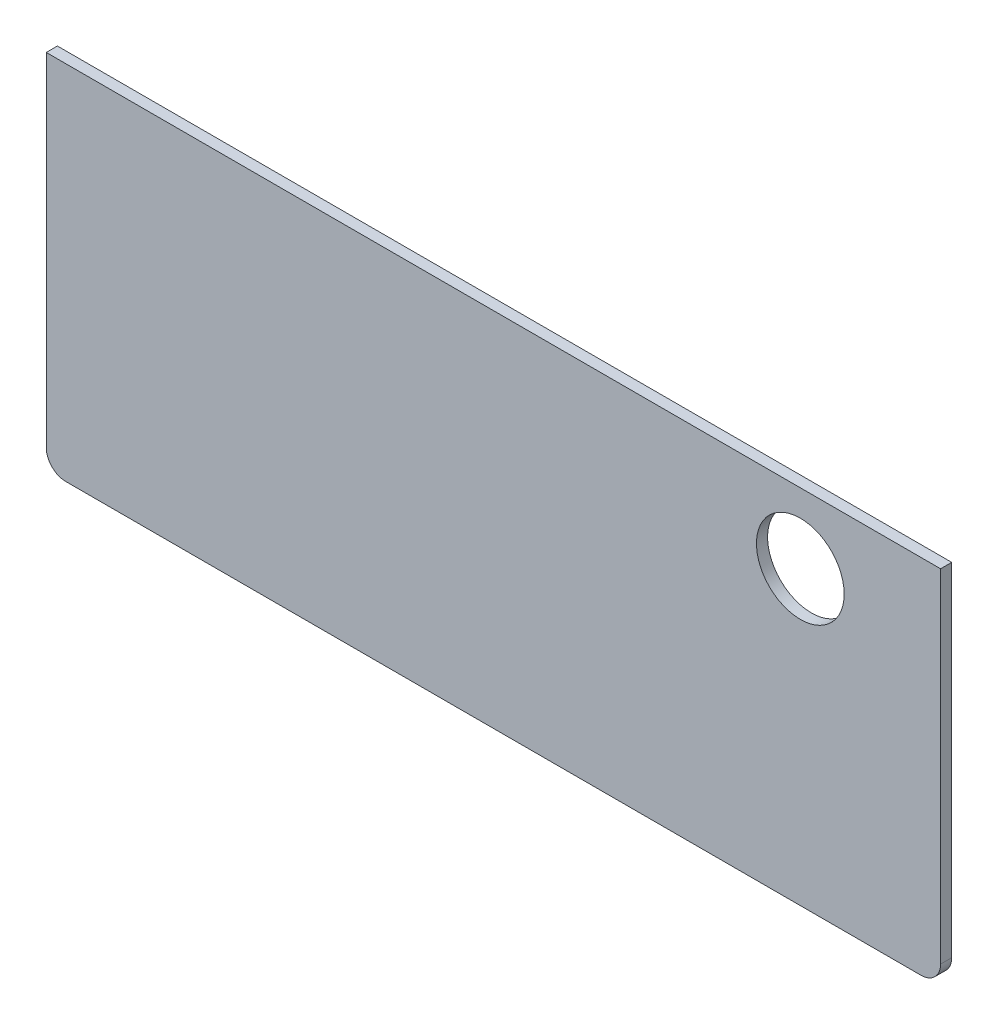
ISO-10303-21;
HEADER;
FILE_DESCRIPTION(('STEP AP214'),'2;1');
FILE_NAME('part.step','',(''),(''),'','','');
FILE_SCHEMA(('AUTOMOTIVE_DESIGN { 1 0 10303 214 1 1 1 1 }'));
ENDSEC;
DATA;
#1=APPLICATION_CONTEXT('core data for automotive mechanical design processes');
#2=APPLICATION_PROTOCOL_DEFINITION('international standard','automotive_design',2000,#1);
#3=PRODUCT_CONTEXT('',#1,'mechanical');
#4=PRODUCT('Part','Part','',(#3));
#5=PRODUCT_RELATED_PRODUCT_CATEGORY('part','',(#4));
#6=PRODUCT_DEFINITION_FORMATION('','',#4);
#7=PRODUCT_DEFINITION_CONTEXT('part definition',#1,'design');
#8=PRODUCT_DEFINITION('design','',#6,#7);
#9=PRODUCT_DEFINITION_SHAPE('','',#8);
#10=(LENGTH_UNIT() NAMED_UNIT(*) SI_UNIT(.MILLI.,.METRE.));
#11=(NAMED_UNIT(*) PLANE_ANGLE_UNIT() SI_UNIT($,.RADIAN.));
#12=(NAMED_UNIT(*) SI_UNIT($,.STERADIAN.) SOLID_ANGLE_UNIT());
#13=UNCERTAINTY_MEASURE_WITH_UNIT(LENGTH_MEASURE(1.E-05),#10,'distance_accuracy_value','');
#14=(GEOMETRIC_REPRESENTATION_CONTEXT(3) GLOBAL_UNCERTAINTY_ASSIGNED_CONTEXT((#13)) GLOBAL_UNIT_ASSIGNED_CONTEXT((#10,
#11,#12)) REPRESENTATION_CONTEXT('',''));
#15=CARTESIAN_POINT('',(0.,0.,0.));
#16=DIRECTION('',(0.,0.,1.));
#17=DIRECTION('',(1.,0.,0.));
#18=AXIS2_PLACEMENT_3D('',#15,#16,#17);
#19=CARTESIAN_POINT('',(0.,0.,3.175));
#20=DIRECTION('',(0.,0.,1.));
#21=DIRECTION('',(1.,0.,0.));
#22=AXIS2_PLACEMENT_3D('',#19,#20,#21);
#23=PLANE('',#22);
#24=DIRECTION('',(0.,-1.,0.));
#25=VECTOR('',#24,1.);
#26=CARTESIAN_POINT('',(-151.765375854214,27.1867881548974,3.175));
#27=LINE('',#26,#25);
#28=CARTESIAN_POINT('',(-151.765375854214,27.1867881548974,3.175));
#29=VERTEX_POINT('',#28);
#30=CARTESIAN_POINT('',(-151.765375854214,-70.4319618451025,3.175));
#31=VERTEX_POINT('',#30);
#32=EDGE_CURVE('E86',#29,#31,#27,.T.);
#33=ORIENTED_EDGE('',*,*,#32,.T.);
#34=CARTESIAN_POINT('',(-146.209125854214,-70.4319618451025,3.175));
#35=DIRECTION('',(0.,0.,1.));
#36=DIRECTION('',(1.,0.,0.));
#37=AXIS2_PLACEMENT_3D('',#34,#35,#36);
#38=CIRCLE('',#37,5.55625);
#39=CARTESIAN_POINT('',(-146.209125854214,-75.9882118451025,3.175));
#40=VERTEX_POINT('',#39);
#41=EDGE_CURVE('E41',#31,#40,#38,.T.);
#42=ORIENTED_EDGE('',*,*,#41,.T.);
#43=DIRECTION('',(1.,0.,0.));
#44=VECTOR('',#43,1.);
#45=CARTESIAN_POINT('',(-151.765375854214,-75.9882118451025,3.175));
#46=LINE('',#45,#44);
#47=CARTESIAN_POINT('',(97.6783741457859,-75.9882118451025,3.175));
#48=VERTEX_POINT('',#47);
#49=EDGE_CURVE('E93',#40,#48,#46,.T.);
#50=ORIENTED_EDGE('',*,*,#49,.T.);
#51=CARTESIAN_POINT('',(97.6783741457859,-70.4319618451025,3.175));
#52=DIRECTION('',(0.,0.,1.));
#53=DIRECTION('',(1.,0.,0.));
#54=AXIS2_PLACEMENT_3D('',#51,#52,#53);
#55=CIRCLE('',#54,5.55625);
#56=CARTESIAN_POINT('',(103.234624145786,-70.4319618451025,3.175));
#57=VERTEX_POINT('',#56);
#58=EDGE_CURVE('E48',#48,#57,#55,.T.);
#59=ORIENTED_EDGE('',*,*,#58,.T.);
#60=DIRECTION('',(0.,1.,0.));
#61=VECTOR('',#60,1.);
#62=CARTESIAN_POINT('',(103.234624145786,-75.9882118451025,3.175));
#63=LINE('',#62,#61);
#64=CARTESIAN_POINT('',(103.234624145786,27.1867881548975,3.175));
#65=VERTEX_POINT('',#64);
#66=EDGE_CURVE('E98',#57,#65,#63,.T.);
#67=ORIENTED_EDGE('',*,*,#66,.T.);
#68=DIRECTION('',(-1.,0.,0.));
#69=VECTOR('',#68,1.);
#70=CARTESIAN_POINT('',(103.234624145786,27.1867881548975,3.175));
#71=LINE('',#70,#69);
#72=EDGE_CURVE('E94',#65,#29,#71,.T.);
#73=ORIENTED_EDGE('',*,*,#72,.T.);
#74=EDGE_LOOP('',(#33,#42,#50,#59,#67,#73));
#75=FACE_BOUND('',#74,.T.);
#76=CARTESIAN_POINT('',(63.2346241457858,7.18678815489747,3.175));
#77=DIRECTION('',(0.,0.,1.));
#78=DIRECTION('',(1.,0.,0.));
#79=AXIS2_PLACEMENT_3D('',#76,#77,#78);
#80=CIRCLE('',#79,12.5);
#81=CARTESIAN_POINT('',(75.7346241457858,7.18678815489747,3.175));
#82=VERTEX_POINT('',#81);
#83=EDGE_CURVE('E139',#82,#82,#80,.T.);
#84=ORIENTED_EDGE('',*,*,#83,.F.);
#85=EDGE_LOOP('',(#84));
#86=FACE_BOUND('',#85,.T.);
#87=ADVANCED_FACE('F33',(#75,#86),#23,.T.);
#88=CARTESIAN_POINT('',(0.,0.,0.));
#89=DIRECTION('',(0.,0.,1.));
#90=DIRECTION('',(1.,0.,0.));
#91=AXIS2_PLACEMENT_3D('',#88,#89,#90);
#92=PLANE('',#91);
#93=DIRECTION('',(1.,0.,0.));
#94=VECTOR('',#93,1.);
#95=CARTESIAN_POINT('',(-151.765375854214,-75.9882118451025,0.));
#96=LINE('',#95,#94);
#97=CARTESIAN_POINT('',(-146.209125854214,-75.9882118451025,0.));
#98=VERTEX_POINT('',#97);
#99=CARTESIAN_POINT('',(97.6783741457859,-75.9882118451025,0.));
#100=VERTEX_POINT('',#99);
#101=EDGE_CURVE('E136',#98,#100,#96,.T.);
#102=ORIENTED_EDGE('',*,*,#101,.F.);
#103=CARTESIAN_POINT('',(-146.209125854214,-70.4319618451025,0.));
#104=DIRECTION('',(0.,0.,1.));
#105=DIRECTION('',(1.,0.,0.));
#106=AXIS2_PLACEMENT_3D('',#103,#104,#105);
#107=CIRCLE('',#106,5.55625);
#108=CARTESIAN_POINT('',(-151.765375854214,-70.4319618451025,0.));
#109=VERTEX_POINT('',#108);
#110=EDGE_CURVE('E119',#98,#109,#107,.F.);
#111=ORIENTED_EDGE('',*,*,#110,.T.);
#112=DIRECTION('',(0.,-1.,0.));
#113=VECTOR('',#112,1.);
#114=CARTESIAN_POINT('',(-151.765375854214,27.1867881548974,0.));
#115=LINE('',#114,#113);
#116=CARTESIAN_POINT('',(-151.765375854214,27.1867881548974,0.));
#117=VERTEX_POINT('',#116);
#118=EDGE_CURVE('E135',#117,#109,#115,.T.);
#119=ORIENTED_EDGE('',*,*,#118,.F.);
#120=DIRECTION('',(-1.,0.,0.));
#121=VECTOR('',#120,1.);
#122=CARTESIAN_POINT('',(103.234624145786,27.1867881548975,0.));
#123=LINE('',#122,#121);
#124=CARTESIAN_POINT('',(103.234624145786,27.1867881548975,0.));
#125=VERTEX_POINT('',#124);
#126=EDGE_CURVE('E106',#125,#117,#123,.T.);
#127=ORIENTED_EDGE('',*,*,#126,.F.);
#128=DIRECTION('',(0.,1.,0.));
#129=VECTOR('',#128,1.);
#130=CARTESIAN_POINT('',(103.234624145786,-75.9882118451025,0.));
#131=LINE('',#130,#129);
#132=CARTESIAN_POINT('',(103.234624145786,-70.4319618451025,0.));
#133=VERTEX_POINT('',#132);
#134=EDGE_CURVE('E102',#133,#125,#131,.T.);
#135=ORIENTED_EDGE('',*,*,#134,.F.);
#136=CARTESIAN_POINT('',(97.6783741457859,-70.4319618451025,0.));
#137=DIRECTION('',(0.,0.,1.));
#138=DIRECTION('',(1.,0.,0.));
#139=AXIS2_PLACEMENT_3D('',#136,#137,#138);
#140=CIRCLE('',#139,5.55625);
#141=EDGE_CURVE('E117',#133,#100,#140,.F.);
#142=ORIENTED_EDGE('',*,*,#141,.T.);
#143=EDGE_LOOP('',(#102,#111,#119,#127,#135,#142));
#144=FACE_BOUND('',#143,.T.);
#145=CARTESIAN_POINT('',(63.2346241457858,7.18678815489747,0.));
#146=DIRECTION('',(0.,0.,1.));
#147=DIRECTION('',(1.,0.,0.));
#148=AXIS2_PLACEMENT_3D('',#145,#146,#147);
#149=CIRCLE('',#148,12.5);
#150=CARTESIAN_POINT('',(75.7346241457858,7.18678815489747,0.));
#151=VERTEX_POINT('',#150);
#152=EDGE_CURVE('E224',#151,#151,#149,.T.);
#153=ORIENTED_EDGE('',*,*,#152,.T.);
#154=EDGE_LOOP('',(#153));
#155=FACE_BOUND('',#154,.T.);
#156=ADVANCED_FACE('F133',(#144,#155),#92,.F.);
#157=CARTESIAN_POINT('',(103.234624145786,27.1867881548975,3.175));
#158=DIRECTION('',(0.,-1.,0.));
#159=DIRECTION('',(1.,0.,0.));
#160=AXIS2_PLACEMENT_3D('',#157,#158,#159);
#161=PLANE('',#160);
#162=ORIENTED_EDGE('',*,*,#126,.T.);
#163=DIRECTION('',(0.,0.,-1.));
#164=VECTOR('',#163,1.);
#165=CARTESIAN_POINT('',(-151.765375854214,27.1867881548974,3.175));
#166=LINE('',#165,#164);
#167=EDGE_CURVE('E90',#29,#117,#166,.T.);
#168=ORIENTED_EDGE('',*,*,#167,.F.);
#169=ORIENTED_EDGE('',*,*,#72,.F.);
#170=DIRECTION('',(0.,0.,-1.));
#171=VECTOR('',#170,1.);
#172=CARTESIAN_POINT('',(103.234624145786,27.1867881548975,3.175));
#173=LINE('',#172,#171);
#174=EDGE_CURVE('E108',#65,#125,#173,.T.);
#175=ORIENTED_EDGE('',*,*,#174,.T.);
#176=EDGE_LOOP('',(#162,#168,#169,#175));
#177=FACE_BOUND('',#176,.T.);
#178=ADVANCED_FACE('F104',(#177),#161,.F.);
#179=CARTESIAN_POINT('',(-151.765375854214,27.1867881548974,3.175));
#180=DIRECTION('',(1.,0.,0.));
#181=DIRECTION('',(0.,0.,-1.));
#182=AXIS2_PLACEMENT_3D('',#179,#180,#181);
#183=PLANE('',#182);
#184=ORIENTED_EDGE('',*,*,#118,.T.);
#185=DIRECTION('',(0.,0.,-1.));
#186=VECTOR('',#185,1.);
#187=CARTESIAN_POINT('',(-151.765375854214,-70.4319618451025,3.175));
#188=LINE('',#187,#186);
#189=EDGE_CURVE('E56',#109,#31,#188,.F.);
#190=ORIENTED_EDGE('',*,*,#189,.T.);
#191=ORIENTED_EDGE('',*,*,#32,.F.);
#192=ORIENTED_EDGE('',*,*,#167,.T.);
#193=EDGE_LOOP('',(#184,#190,#191,#192));
#194=FACE_BOUND('',#193,.T.);
#195=ADVANCED_FACE('F88',(#194),#183,.F.);
#196=CARTESIAN_POINT('',(-151.765375854214,-75.9882118451025,3.175));
#197=DIRECTION('',(0.,1.,0.));
#198=DIRECTION('',(0.,0.,1.));
#199=AXIS2_PLACEMENT_3D('',#196,#197,#198);
#200=PLANE('',#199);
#201=ORIENTED_EDGE('',*,*,#49,.F.);
#202=DIRECTION('',(0.,0.,-1.));
#203=VECTOR('',#202,1.);
#204=CARTESIAN_POINT('',(-146.209125854214,-75.9882118451025,3.175));
#205=LINE('',#204,#203);
#206=EDGE_CURVE('E110',#40,#98,#205,.T.);
#207=ORIENTED_EDGE('',*,*,#206,.T.);
#208=ORIENTED_EDGE('',*,*,#101,.T.);
#209=DIRECTION('',(0.,0.,-1.));
#210=VECTOR('',#209,1.);
#211=CARTESIAN_POINT('',(97.6783741457859,-75.9882118451025,3.175));
#212=LINE('',#211,#210);
#213=EDGE_CURVE('E107',#100,#48,#212,.F.);
#214=ORIENTED_EDGE('',*,*,#213,.T.);
#215=EDGE_LOOP('',(#201,#207,#208,#214));
#216=FACE_BOUND('',#215,.T.);
#217=ADVANCED_FACE('F126',(#216),#200,.F.);
#218=CARTESIAN_POINT('',(103.234624145786,-75.9882118451025,3.175));
#219=DIRECTION('',(-1.,0.,0.));
#220=DIRECTION('',(0.,0.,1.));
#221=AXIS2_PLACEMENT_3D('',#218,#219,#220);
#222=PLANE('',#221);
#223=ORIENTED_EDGE('',*,*,#66,.F.);
#224=DIRECTION('',(0.,0.,-1.));
#225=VECTOR('',#224,1.);
#226=CARTESIAN_POINT('',(103.234624145786,-70.4319618451025,3.175));
#227=LINE('',#226,#225);
#228=EDGE_CURVE('E11',#57,#133,#227,.T.);
#229=ORIENTED_EDGE('',*,*,#228,.T.);
#230=ORIENTED_EDGE('',*,*,#134,.T.);
#231=ORIENTED_EDGE('',*,*,#174,.F.);
#232=EDGE_LOOP('',(#223,#229,#230,#231));
#233=FACE_BOUND('',#232,.T.);
#234=ADVANCED_FACE('F144',(#233),#222,.F.);
#235=CARTESIAN_POINT('',(63.2346241457858,7.18678815489747,3.175));
#236=DIRECTION('',(0.,0.,-1.));
#237=DIRECTION('',(-1.,0.,0.));
#238=AXIS2_PLACEMENT_3D('',#235,#236,#237);
#239=CYLINDRICAL_SURFACE('',#238,12.5);
#240=ORIENTED_EDGE('',*,*,#83,.T.);
#241=EDGE_LOOP('',(#240));
#242=FACE_BOUND('',#241,.T.);
#243=ORIENTED_EDGE('',*,*,#152,.F.);
#244=EDGE_LOOP('',(#243));
#245=FACE_BOUND('',#244,.T.);
#246=ADVANCED_FACE('F151',(#242,#245),#239,.F.);
#247=CARTESIAN_POINT('',(-146.209125854214,-70.4319618451025,3.175));
#248=DIRECTION('',(0.,0.,-1.));
#249=DIRECTION('',(-1.,0.,0.));
#250=AXIS2_PLACEMENT_3D('',#247,#248,#249);
#251=CYLINDRICAL_SURFACE('',#250,5.55625);
#252=ORIENTED_EDGE('',*,*,#41,.F.);
#253=ORIENTED_EDGE('',*,*,#189,.F.);
#254=ORIENTED_EDGE('',*,*,#110,.F.);
#255=ORIENTED_EDGE('',*,*,#206,.F.);
#256=EDGE_LOOP('',(#252,#253,#254,#255));
#257=FACE_BOUND('',#256,.T.);
#258=ADVANCED_FACE('F131',(#257),#251,.T.);
#259=CARTESIAN_POINT('',(97.6783741457859,-70.4319618451025,3.175));
#260=DIRECTION('',(0.,0.,-1.));
#261=DIRECTION('',(-1.,0.,0.));
#262=AXIS2_PLACEMENT_3D('',#259,#260,#261);
#263=CYLINDRICAL_SURFACE('',#262,5.55625);
#264=ORIENTED_EDGE('',*,*,#58,.F.);
#265=ORIENTED_EDGE('',*,*,#213,.F.);
#266=ORIENTED_EDGE('',*,*,#141,.F.);
#267=ORIENTED_EDGE('',*,*,#228,.F.);
#268=EDGE_LOOP('',(#264,#265,#266,#267));
#269=FACE_BOUND('',#268,.T.);
#270=ADVANCED_FACE('F35',(#269),#263,.T.);
#271=CLOSED_SHELL('',(#87,#156,#178,#195,#217,#234,#246,#258,#270));
#272=MANIFOLD_SOLID_BREP('B2',#271);
#273=ADVANCED_BREP_SHAPE_REPRESENTATION('',(#18,#272),#14);
#274=SHAPE_DEFINITION_REPRESENTATION(#9,#273);
ENDSEC;
END-ISO-10303-21;
